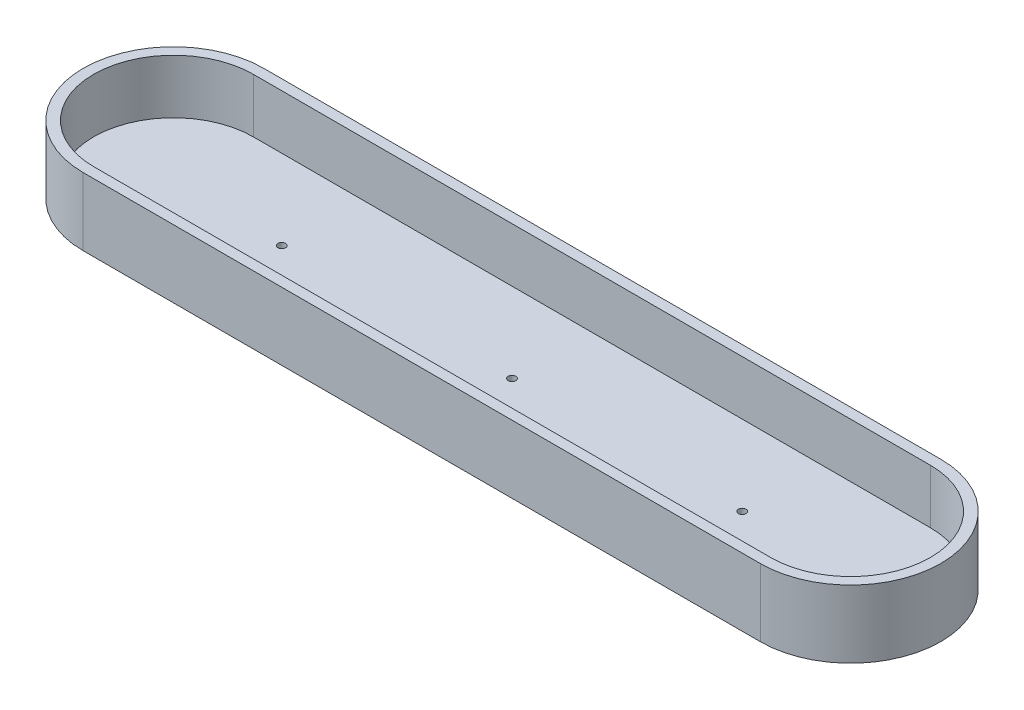
ISO-10303-21;
HEADER;
FILE_DESCRIPTION(('STEP AP214'),'2;1');
FILE_NAME('part.step','',(''),(''),'','','');
FILE_SCHEMA(('AUTOMOTIVE_DESIGN { 1 0 10303 214 1 1 1 1 }'));
ENDSEC;
DATA;
#1=APPLICATION_CONTEXT('core data for automotive mechanical design processes');
#2=APPLICATION_PROTOCOL_DEFINITION('international standard','automotive_design',2000,#1);
#3=PRODUCT_CONTEXT('',#1,'mechanical');
#4=PRODUCT('Part','Part','',(#3));
#5=PRODUCT_RELATED_PRODUCT_CATEGORY('part','',(#4));
#6=PRODUCT_DEFINITION_FORMATION('','',#4);
#7=PRODUCT_DEFINITION_CONTEXT('part definition',#1,'design');
#8=PRODUCT_DEFINITION('design','',#6,#7);
#9=PRODUCT_DEFINITION_SHAPE('','',#8);
#10=(LENGTH_UNIT() NAMED_UNIT(*) SI_UNIT(.MILLI.,.METRE.));
#11=(NAMED_UNIT(*) PLANE_ANGLE_UNIT() SI_UNIT($,.RADIAN.));
#12=(NAMED_UNIT(*) SI_UNIT($,.STERADIAN.) SOLID_ANGLE_UNIT());
#13=UNCERTAINTY_MEASURE_WITH_UNIT(LENGTH_MEASURE(1.E-05),#10,'distance_accuracy_value','');
#14=(GEOMETRIC_REPRESENTATION_CONTEXT(3) GLOBAL_UNCERTAINTY_ASSIGNED_CONTEXT((#13)) GLOBAL_UNIT_ASSIGNED_CONTEXT((#10,
#11,#12)) REPRESENTATION_CONTEXT('',''));
#15=CARTESIAN_POINT('',(0.,0.,0.));
#16=DIRECTION('',(0.,0.,1.));
#17=DIRECTION('',(1.,0.,0.));
#18=AXIS2_PLACEMENT_3D('',#15,#16,#17);
#19=CARTESIAN_POINT('',(-95.25,3.81,0.));
#20=DIRECTION('',(0.,1.,0.));
#21=DIRECTION('',(0.,0.,1.));
#22=AXIS2_PLACEMENT_3D('',#19,#20,#21);
#23=PLANE('',#22);
#24=CARTESIAN_POINT('',(64.77,3.81,0.));
#25=DIRECTION('',(0.,1.,0.));
#26=DIRECTION('',(0.,0.,1.));
#27=AXIS2_PLACEMENT_3D('',#24,#25,#26);
#28=CIRCLE('',#27,1.0795);
#29=CARTESIAN_POINT('',(64.77,3.81,-1.0795));
#30=VERTEX_POINT('',#29);
#31=EDGE_CURVE('E137',#30,#30,#28,.T.);
#32=ORIENTED_EDGE('',*,*,#31,.F.);
#33=EDGE_LOOP('',(#32));
#34=FACE_BOUND('',#33,.T.);
#35=CARTESIAN_POINT('',(-64.77,3.81,0.));
#36=DIRECTION('',(0.,1.,0.));
#37=DIRECTION('',(0.,0.,1.));
#38=AXIS2_PLACEMENT_3D('',#35,#36,#37);
#39=CIRCLE('',#38,1.0795);
#40=CARTESIAN_POINT('',(-64.77,3.81,-1.0795));
#41=VERTEX_POINT('',#40);
#42=EDGE_CURVE('E141',#41,#41,#39,.T.);
#43=ORIENTED_EDGE('',*,*,#42,.F.);
#44=EDGE_LOOP('',(#43));
#45=FACE_BOUND('',#44,.T.);
#46=CARTESIAN_POINT('',(0.,3.81,0.));
#47=DIRECTION('',(0.,1.,0.));
#48=DIRECTION('',(0.,0.,1.));
#49=AXIS2_PLACEMENT_3D('',#46,#47,#48);
#50=CIRCLE('',#49,1.0795);
#51=CARTESIAN_POINT('',(0.,3.81,-1.0795));
#52=VERTEX_POINT('',#51);
#53=EDGE_CURVE('E277',#52,#52,#50,.T.);
#54=ORIENTED_EDGE('',*,*,#53,.F.);
#55=EDGE_LOOP('',(#54));
#56=FACE_BOUND('',#55,.T.);
#57=CARTESIAN_POINT('',(-95.25,3.81,0.));
#58=DIRECTION('',(0.,1.,0.));
#59=DIRECTION('',(0.,0.,1.));
#60=AXIS2_PLACEMENT_3D('',#57,#58,#59);
#61=CIRCLE('',#60,22.479);
#62=CARTESIAN_POINT('',(-95.25,3.81,-22.479));
#63=VERTEX_POINT('',#62);
#64=CARTESIAN_POINT('',(-95.25,3.81,22.479));
#65=VERTEX_POINT('',#64);
#66=EDGE_CURVE('E118',#63,#65,#61,.T.);
#67=ORIENTED_EDGE('',*,*,#66,.T.);
#68=DIRECTION('',(1.,0.,0.));
#69=VECTOR('',#68,1.);
#70=CARTESIAN_POINT('',(-95.25,3.81,22.479));
#71=LINE('',#70,#69);
#72=CARTESIAN_POINT('',(95.25,3.81,22.479));
#73=VERTEX_POINT('',#72);
#74=EDGE_CURVE('E71',#65,#73,#71,.T.);
#75=ORIENTED_EDGE('',*,*,#74,.T.);
#76=CARTESIAN_POINT('',(95.25,3.81,0.));
#77=DIRECTION('',(0.,1.,0.));
#78=DIRECTION('',(0.,0.,-1.));
#79=AXIS2_PLACEMENT_3D('',#76,#77,#78);
#80=CIRCLE('',#79,22.479);
#81=CARTESIAN_POINT('',(95.25,3.81,-22.479));
#82=VERTEX_POINT('',#81);
#83=EDGE_CURVE('E56',#73,#82,#80,.T.);
#84=ORIENTED_EDGE('',*,*,#83,.T.);
#85=DIRECTION('',(-1.,0.,0.));
#86=VECTOR('',#85,1.);
#87=CARTESIAN_POINT('',(-95.25,3.81,-22.479));
#88=LINE('',#87,#86);
#89=EDGE_CURVE('E11',#82,#63,#88,.T.);
#90=ORIENTED_EDGE('',*,*,#89,.T.);
#91=EDGE_LOOP('',(#67,#75,#84,#90));
#92=FACE_BOUND('',#91,.T.);
#93=ADVANCED_FACE('F47',(#34,#45,#56,#92),#23,.T.);
#94=CARTESIAN_POINT('',(-95.25,19.05,0.));
#95=DIRECTION('',(0.,-1.,0.));
#96=DIRECTION('',(0.,0.,-1.));
#97=AXIS2_PLACEMENT_3D('',#94,#95,#96);
#98=CYLINDRICAL_SURFACE('',#97,25.4);
#99=CARTESIAN_POINT('',(-95.25,0.,0.));
#100=DIRECTION('',(0.,-1.,0.));
#101=DIRECTION('',(0.,0.,-1.));
#102=AXIS2_PLACEMENT_3D('',#99,#100,#101);
#103=CIRCLE('',#102,25.4);
#104=CARTESIAN_POINT('',(-95.25,0.,25.4));
#105=VERTEX_POINT('',#104);
#106=CARTESIAN_POINT('',(-95.25,0.,-25.4));
#107=VERTEX_POINT('',#106);
#108=EDGE_CURVE('E152',#105,#107,#103,.T.);
#109=ORIENTED_EDGE('',*,*,#108,.F.);
#110=DIRECTION('',(0.,-1.,0.));
#111=VECTOR('',#110,1.);
#112=CARTESIAN_POINT('',(-95.25,19.05,25.4));
#113=LINE('',#112,#111);
#114=CARTESIAN_POINT('',(-95.25,19.05,25.4));
#115=VERTEX_POINT('',#114);
#116=EDGE_CURVE('E190',#115,#105,#113,.T.);
#117=ORIENTED_EDGE('',*,*,#116,.F.);
#118=CARTESIAN_POINT('',(-95.25,19.05,0.));
#119=DIRECTION('',(0.,-1.,0.));
#120=DIRECTION('',(0.,0.,-1.));
#121=AXIS2_PLACEMENT_3D('',#118,#119,#120);
#122=CIRCLE('',#121,25.4);
#123=CARTESIAN_POINT('',(-95.25,19.05,-25.4));
#124=VERTEX_POINT('',#123);
#125=EDGE_CURVE('E158',#115,#124,#122,.T.);
#126=ORIENTED_EDGE('',*,*,#125,.T.);
#127=DIRECTION('',(0.,-1.,0.));
#128=VECTOR('',#127,1.);
#129=CARTESIAN_POINT('',(-95.25,19.05,-25.4));
#130=LINE('',#129,#128);
#131=EDGE_CURVE('E175',#124,#107,#130,.T.);
#132=ORIENTED_EDGE('',*,*,#131,.T.);
#133=EDGE_LOOP('',(#109,#117,#126,#132));
#134=FACE_BOUND('',#133,.T.);
#135=ADVANCED_FACE('F220',(#134),#98,.T.);
#136=CARTESIAN_POINT('',(-95.25,19.05,25.4));
#137=DIRECTION('',(0.,0.,1.));
#138=DIRECTION('',(1.,0.,0.));
#139=AXIS2_PLACEMENT_3D('',#136,#137,#138);
#140=PLANE('',#139);
#141=DIRECTION('',(-1.,0.,0.));
#142=VECTOR('',#141,1.);
#143=CARTESIAN_POINT('',(-95.25,0.,25.4));
#144=LINE('',#143,#142);
#145=CARTESIAN_POINT('',(95.25,0.,25.4));
#146=VERTEX_POINT('',#145);
#147=EDGE_CURVE('E163',#146,#105,#144,.T.);
#148=ORIENTED_EDGE('',*,*,#147,.F.);
#149=DIRECTION('',(0.,-1.,0.));
#150=VECTOR('',#149,1.);
#151=CARTESIAN_POINT('',(95.25,19.05,25.4));
#152=LINE('',#151,#150);
#153=CARTESIAN_POINT('',(95.25,19.05,25.4));
#154=VERTEX_POINT('',#153);
#155=EDGE_CURVE('E193',#154,#146,#152,.T.);
#156=ORIENTED_EDGE('',*,*,#155,.F.);
#157=DIRECTION('',(-1.,0.,0.));
#158=VECTOR('',#157,1.);
#159=CARTESIAN_POINT('',(-95.25,19.05,25.4));
#160=LINE('',#159,#158);
#161=EDGE_CURVE('E171',#154,#115,#160,.T.);
#162=ORIENTED_EDGE('',*,*,#161,.T.);
#163=ORIENTED_EDGE('',*,*,#116,.T.);
#164=EDGE_LOOP('',(#148,#156,#162,#163));
#165=FACE_BOUND('',#164,.T.);
#166=ADVANCED_FACE('F227',(#165),#140,.T.);
#167=CARTESIAN_POINT('',(95.25,19.05,0.));
#168=DIRECTION('',(0.,-1.,0.));
#169=DIRECTION('',(0.,0.,-1.));
#170=AXIS2_PLACEMENT_3D('',#167,#168,#169);
#171=CYLINDRICAL_SURFACE('',#170,25.4);
#172=CARTESIAN_POINT('',(95.25,0.,0.));
#173=DIRECTION('',(0.,-1.,0.));
#174=DIRECTION('',(0.,0.,1.));
#175=AXIS2_PLACEMENT_3D('',#172,#173,#174);
#176=CIRCLE('',#175,25.4);
#177=CARTESIAN_POINT('',(95.25,0.,-25.4));
#178=VERTEX_POINT('',#177);
#179=EDGE_CURVE('E183',#178,#146,#176,.T.);
#180=ORIENTED_EDGE('',*,*,#179,.F.);
#181=DIRECTION('',(0.,-1.,0.));
#182=VECTOR('',#181,1.);
#183=CARTESIAN_POINT('',(95.25,19.05,-25.4));
#184=LINE('',#183,#182);
#185=CARTESIAN_POINT('',(95.25,19.05,-25.4));
#186=VERTEX_POINT('',#185);
#187=EDGE_CURVE('E196',#186,#178,#184,.T.);
#188=ORIENTED_EDGE('',*,*,#187,.F.);
#189=CARTESIAN_POINT('',(95.25,19.05,0.));
#190=DIRECTION('',(0.,-1.,0.));
#191=DIRECTION('',(0.,0.,1.));
#192=AXIS2_PLACEMENT_3D('',#189,#190,#191);
#193=CIRCLE('',#192,25.4);
#194=EDGE_CURVE('E167',#186,#154,#193,.T.);
#195=ORIENTED_EDGE('',*,*,#194,.T.);
#196=ORIENTED_EDGE('',*,*,#155,.T.);
#197=EDGE_LOOP('',(#180,#188,#195,#196));
#198=FACE_BOUND('',#197,.T.);
#199=ADVANCED_FACE('F236',(#198),#171,.T.);
#200=CARTESIAN_POINT('',(-95.25,19.05,-25.4));
#201=DIRECTION('',(0.,0.,-1.));
#202=DIRECTION('',(-1.,0.,0.));
#203=AXIS2_PLACEMENT_3D('',#200,#201,#202);
#204=PLANE('',#203);
#205=DIRECTION('',(1.,0.,0.));
#206=VECTOR('',#205,1.);
#207=CARTESIAN_POINT('',(-95.25,0.,-25.4));
#208=LINE('',#207,#206);
#209=EDGE_CURVE('E179',#107,#178,#208,.T.);
#210=ORIENTED_EDGE('',*,*,#209,.F.);
#211=ORIENTED_EDGE('',*,*,#131,.F.);
#212=DIRECTION('',(1.,0.,0.));
#213=VECTOR('',#212,1.);
#214=CARTESIAN_POINT('',(-95.25,19.05,-25.4));
#215=LINE('',#214,#213);
#216=EDGE_CURVE('E162',#124,#186,#215,.T.);
#217=ORIENTED_EDGE('',*,*,#216,.T.);
#218=ORIENTED_EDGE('',*,*,#187,.T.);
#219=EDGE_LOOP('',(#210,#211,#217,#218));
#220=FACE_BOUND('',#219,.T.);
#221=ADVANCED_FACE('F233',(#220),#204,.T.);
#222=CARTESIAN_POINT('',(-95.25,19.05,0.));
#223=DIRECTION('',(0.,-1.,0.));
#224=DIRECTION('',(0.,0.,-1.));
#225=AXIS2_PLACEMENT_3D('',#222,#223,#224);
#226=PLANE('',#225);
#227=DIRECTION('',(-1.,0.,0.));
#228=VECTOR('',#227,1.);
#229=CARTESIAN_POINT('',(95.25,19.05,22.479));
#230=LINE('',#229,#228);
#231=CARTESIAN_POINT('',(95.25,19.05,22.479));
#232=VERTEX_POINT('',#231);
#233=CARTESIAN_POINT('',(-95.25,19.05,22.479));
#234=VERTEX_POINT('',#233);
#235=EDGE_CURVE('E121',#232,#234,#230,.T.);
#236=ORIENTED_EDGE('',*,*,#235,.T.);
#237=CARTESIAN_POINT('',(-95.25,19.05,0.));
#238=DIRECTION('',(0.,-1.,0.));
#239=DIRECTION('',(0.,0.,-1.));
#240=AXIS2_PLACEMENT_3D('',#237,#238,#239);
#241=CIRCLE('',#240,22.479);
#242=CARTESIAN_POINT('',(-95.25,19.05,-22.479));
#243=VERTEX_POINT('',#242);
#244=EDGE_CURVE('E115',#234,#243,#241,.T.);
#245=ORIENTED_EDGE('',*,*,#244,.T.);
#246=DIRECTION('',(1.,0.,0.));
#247=VECTOR('',#246,1.);
#248=CARTESIAN_POINT('',(95.25,19.05,-22.479));
#249=LINE('',#248,#247);
#250=CARTESIAN_POINT('',(95.25,19.05,-22.479));
#251=VERTEX_POINT('',#250);
#252=EDGE_CURVE('E125',#243,#251,#249,.T.);
#253=ORIENTED_EDGE('',*,*,#252,.T.);
#254=CARTESIAN_POINT('',(95.25,19.05,0.));
#255=DIRECTION('',(0.,-1.,0.));
#256=DIRECTION('',(0.,0.,1.));
#257=AXIS2_PLACEMENT_3D('',#254,#255,#256);
#258=CIRCLE('',#257,22.479);
#259=EDGE_CURVE('E131',#251,#232,#258,.T.);
#260=ORIENTED_EDGE('',*,*,#259,.T.);
#261=EDGE_LOOP('',(#236,#245,#253,#260));
#262=FACE_BOUND('',#261,.T.);
#263=ORIENTED_EDGE('',*,*,#125,.F.);
#264=ORIENTED_EDGE('',*,*,#161,.F.);
#265=ORIENTED_EDGE('',*,*,#194,.F.);
#266=ORIENTED_EDGE('',*,*,#216,.F.);
#267=EDGE_LOOP('',(#263,#264,#265,#266));
#268=FACE_BOUND('',#267,.T.);
#269=ADVANCED_FACE('F133',(#262,#268),#226,.F.);
#270=CARTESIAN_POINT('',(-95.25,19.05,0.));
#271=DIRECTION('',(0.,-1.,0.));
#272=DIRECTION('',(0.,0.,-1.));
#273=AXIS2_PLACEMENT_3D('',#270,#271,#272);
#274=CYLINDRICAL_SURFACE('',#273,22.479);
#275=ORIENTED_EDGE('',*,*,#66,.F.);
#276=DIRECTION('',(0.,-1.,0.));
#277=VECTOR('',#276,1.);
#278=CARTESIAN_POINT('',(-95.25,19.05,-22.479));
#279=LINE('',#278,#277);
#280=EDGE_CURVE('E63',#243,#63,#279,.T.);
#281=ORIENTED_EDGE('',*,*,#280,.F.);
#282=ORIENTED_EDGE('',*,*,#244,.F.);
#283=DIRECTION('',(0.,-1.,0.));
#284=VECTOR('',#283,1.);
#285=CARTESIAN_POINT('',(-95.25,19.05,22.479));
#286=LINE('',#285,#284);
#287=EDGE_CURVE('E149',#234,#65,#286,.T.);
#288=ORIENTED_EDGE('',*,*,#287,.T.);
#289=EDGE_LOOP('',(#275,#281,#282,#288));
#290=FACE_BOUND('',#289,.T.);
#291=ADVANCED_FACE('F113',(#290),#274,.F.);
#292=CARTESIAN_POINT('',(95.25,19.05,22.479));
#293=DIRECTION('',(0.,0.,1.));
#294=DIRECTION('',(1.,0.,0.));
#295=AXIS2_PLACEMENT_3D('',#292,#293,#294);
#296=PLANE('',#295);
#297=ORIENTED_EDGE('',*,*,#74,.F.);
#298=ORIENTED_EDGE('',*,*,#287,.F.);
#299=ORIENTED_EDGE('',*,*,#235,.F.);
#300=DIRECTION('',(0.,-1.,0.));
#301=VECTOR('',#300,1.);
#302=CARTESIAN_POINT('',(95.25,19.05,22.479));
#303=LINE('',#302,#301);
#304=EDGE_CURVE('E153',#232,#73,#303,.T.);
#305=ORIENTED_EDGE('',*,*,#304,.T.);
#306=EDGE_LOOP('',(#297,#298,#299,#305));
#307=FACE_BOUND('',#306,.T.);
#308=ADVANCED_FACE('F209',(#307),#296,.F.);
#309=CARTESIAN_POINT('',(95.25,19.05,0.));
#310=DIRECTION('',(0.,-1.,0.));
#311=DIRECTION('',(0.,0.,-1.));
#312=AXIS2_PLACEMENT_3D('',#309,#310,#311);
#313=CYLINDRICAL_SURFACE('',#312,22.479);
#314=ORIENTED_EDGE('',*,*,#83,.F.);
#315=ORIENTED_EDGE('',*,*,#304,.F.);
#316=ORIENTED_EDGE('',*,*,#259,.F.);
#317=DIRECTION('',(0.,-1.,0.));
#318=VECTOR('',#317,1.);
#319=CARTESIAN_POINT('',(95.25,19.05,-22.479));
#320=LINE('',#319,#318);
#321=EDGE_CURVE('E120',#251,#82,#320,.T.);
#322=ORIENTED_EDGE('',*,*,#321,.T.);
#323=EDGE_LOOP('',(#314,#315,#316,#322));
#324=FACE_BOUND('',#323,.T.);
#325=ADVANCED_FACE('F208',(#324),#313,.F.);
#326=CARTESIAN_POINT('',(95.25,19.05,-22.479));
#327=DIRECTION('',(0.,0.,-1.));
#328=DIRECTION('',(-1.,0.,0.));
#329=AXIS2_PLACEMENT_3D('',#326,#327,#328);
#330=PLANE('',#329);
#331=ORIENTED_EDGE('',*,*,#89,.F.);
#332=ORIENTED_EDGE('',*,*,#321,.F.);
#333=ORIENTED_EDGE('',*,*,#252,.F.);
#334=ORIENTED_EDGE('',*,*,#280,.T.);
#335=EDGE_LOOP('',(#331,#332,#333,#334));
#336=FACE_BOUND('',#335,.T.);
#337=ADVANCED_FACE('F126',(#336),#330,.F.);
#338=CARTESIAN_POINT('',(-95.25,0.,0.));
#339=DIRECTION('',(0.,1.,0.));
#340=DIRECTION('',(0.,0.,1.));
#341=AXIS2_PLACEMENT_3D('',#338,#339,#340);
#342=PLANE('',#341);
#343=CARTESIAN_POINT('',(64.77,0.,0.));
#344=DIRECTION('',(0.,-1.,0.));
#345=DIRECTION('',(0.,0.,-1.));
#346=AXIS2_PLACEMENT_3D('',#343,#344,#345);
#347=CIRCLE('',#346,1.0795);
#348=CARTESIAN_POINT('',(64.77,0.,-1.0795));
#349=VERTEX_POINT('',#348);
#350=EDGE_CURVE('E258',#349,#349,#347,.T.);
#351=ORIENTED_EDGE('',*,*,#350,.F.);
#352=EDGE_LOOP('',(#351));
#353=FACE_BOUND('',#352,.T.);
#354=CARTESIAN_POINT('',(-64.77,0.,0.));
#355=DIRECTION('',(0.,-1.,0.));
#356=DIRECTION('',(0.,0.,-1.));
#357=AXIS2_PLACEMENT_3D('',#354,#355,#356);
#358=CIRCLE('',#357,1.0795);
#359=CARTESIAN_POINT('',(-64.77,0.,-1.0795));
#360=VERTEX_POINT('',#359);
#361=EDGE_CURVE('E262',#360,#360,#358,.T.);
#362=ORIENTED_EDGE('',*,*,#361,.F.);
#363=EDGE_LOOP('',(#362));
#364=FACE_BOUND('',#363,.T.);
#365=CARTESIAN_POINT('',(0.,0.,0.));
#366=DIRECTION('',(0.,-1.,0.));
#367=DIRECTION('',(0.,0.,-1.));
#368=AXIS2_PLACEMENT_3D('',#365,#366,#367);
#369=CIRCLE('',#368,1.0795);
#370=CARTESIAN_POINT('',(0.,0.,-1.0795));
#371=VERTEX_POINT('',#370);
#372=EDGE_CURVE('E266',#371,#371,#369,.T.);
#373=ORIENTED_EDGE('',*,*,#372,.F.);
#374=EDGE_LOOP('',(#373));
#375=FACE_BOUND('',#374,.T.);
#376=ORIENTED_EDGE('',*,*,#108,.T.);
#377=ORIENTED_EDGE('',*,*,#209,.T.);
#378=ORIENTED_EDGE('',*,*,#179,.T.);
#379=ORIENTED_EDGE('',*,*,#147,.T.);
#380=EDGE_LOOP('',(#376,#377,#378,#379));
#381=FACE_BOUND('',#380,.T.);
#382=ADVANCED_FACE('F49',(#353,#364,#375,#381),#342,.F.);
#383=CARTESIAN_POINT('',(0.,19.05,0.));
#384=DIRECTION('',(0.,-1.,0.));
#385=DIRECTION('',(0.,0.,-1.));
#386=AXIS2_PLACEMENT_3D('',#383,#384,#385);
#387=CYLINDRICAL_SURFACE('',#386,1.0795);
#388=CARTESIAN_POINT('',(0.,3.81,-1.0795));
#389=CARTESIAN_POINT('',(0.,3.7703125,-1.0795));
#390=CARTESIAN_POINT('',(0.,3.730625,-1.0795));
#391=CARTESIAN_POINT('',(0.,3.65125,-1.0795));
#392=CARTESIAN_POINT('',(0.,3.6115625,-1.0795));
#393=CARTESIAN_POINT('',(0.,3.5321875,-1.0795));
#394=CARTESIAN_POINT('',(0.,3.4925,-1.0795));
#395=CARTESIAN_POINT('',(0.,3.413125,-1.0795));
#396=CARTESIAN_POINT('',(0.,3.3734375,-1.0795));
#397=CARTESIAN_POINT('',(0.,3.2940625,-1.0795));
#398=CARTESIAN_POINT('',(0.,3.254375,-1.0795));
#399=CARTESIAN_POINT('',(0.,3.175,-1.0795));
#400=CARTESIAN_POINT('',(0.,3.1353125,-1.0795));
#401=CARTESIAN_POINT('',(0.,3.0559375,-1.0795));
#402=CARTESIAN_POINT('',(0.,3.01625,-1.0795));
#403=CARTESIAN_POINT('',(0.,2.936875,-1.0795));
#404=CARTESIAN_POINT('',(0.,2.8971875,-1.0795));
#405=CARTESIAN_POINT('',(0.,2.8178125,-1.0795));
#406=CARTESIAN_POINT('',(0.,2.778125,-1.0795));
#407=CARTESIAN_POINT('',(0.,2.69875,-1.0795));
#408=CARTESIAN_POINT('',(0.,2.6590625,-1.0795));
#409=CARTESIAN_POINT('',(0.,2.5796875,-1.0795));
#410=CARTESIAN_POINT('',(0.,2.54,-1.0795));
#411=CARTESIAN_POINT('',(0.,2.460625,-1.0795));
#412=CARTESIAN_POINT('',(0.,2.4209375,-1.0795));
#413=CARTESIAN_POINT('',(0.,2.3415625,-1.0795));
#414=CARTESIAN_POINT('',(0.,2.301875,-1.0795));
#415=CARTESIAN_POINT('',(0.,2.2225,-1.0795));
#416=CARTESIAN_POINT('',(0.,2.1828125,-1.0795));
#417=CARTESIAN_POINT('',(0.,2.1034375,-1.0795));
#418=CARTESIAN_POINT('',(0.,2.06375,-1.0795));
#419=CARTESIAN_POINT('',(0.,1.984375,-1.0795));
#420=CARTESIAN_POINT('',(0.,1.9446875,-1.0795));
#421=CARTESIAN_POINT('',(0.,1.8653125,-1.0795));
#422=CARTESIAN_POINT('',(0.,1.825625,-1.0795));
#423=CARTESIAN_POINT('',(0.,1.74625,-1.0795));
#424=CARTESIAN_POINT('',(0.,1.7065625,-1.0795));
#425=CARTESIAN_POINT('',(0.,1.6271875,-1.0795));
#426=CARTESIAN_POINT('',(0.,1.5875,-1.0795));
#427=CARTESIAN_POINT('',(0.,1.508125,-1.0795));
#428=CARTESIAN_POINT('',(0.,1.4684375,-1.0795));
#429=CARTESIAN_POINT('',(0.,1.3890625,-1.0795));
#430=CARTESIAN_POINT('',(0.,1.349375,-1.0795));
#431=CARTESIAN_POINT('',(0.,1.27,-1.0795));
#432=CARTESIAN_POINT('',(0.,1.2303125,-1.0795));
#433=CARTESIAN_POINT('',(0.,1.1509375,-1.0795));
#434=CARTESIAN_POINT('',(0.,1.11125,-1.0795));
#435=CARTESIAN_POINT('',(0.,1.031875,-1.0795));
#436=CARTESIAN_POINT('',(0.,0.992187500000002,-1.0795));
#437=CARTESIAN_POINT('',(0.,0.912812500000001,-1.0795));
#438=CARTESIAN_POINT('',(0.,0.873125,-1.0795));
#439=CARTESIAN_POINT('',(0.,0.793749999999999,-1.0795));
#440=CARTESIAN_POINT('',(0.,0.7540625,-1.0795));
#441=CARTESIAN_POINT('',(0.,0.6746875,-1.0795));
#442=CARTESIAN_POINT('',(0.,0.635,-1.0795));
#443=CARTESIAN_POINT('',(0.,0.555625000000001,-1.0795));
#444=CARTESIAN_POINT('',(0.,0.515937500000001,-1.0795));
#445=CARTESIAN_POINT('',(0.,0.436562500000001,-1.0795));
#446=CARTESIAN_POINT('',(0.,0.396875000000001,-1.0795));
#447=CARTESIAN_POINT('',(0.,0.317500000000001,-1.0795));
#448=CARTESIAN_POINT('',(0.,0.2778125,-1.0795));
#449=CARTESIAN_POINT('',(0.,0.198437499999999,-1.0795));
#450=CARTESIAN_POINT('',(0.,0.158749999999999,-1.0795));
#451=CARTESIAN_POINT('',(0.,0.0793749999999996,-1.0795));
#452=CARTESIAN_POINT('',(0.,0.0396874999999998,-1.0795));
#453=CARTESIAN_POINT('',(0.,0.,-1.0795));
#454=B_SPLINE_CURVE_WITH_KNOTS('',3,(#388,#389,#390,#391,#392,#393,#394,#395,#396,#397,#398,
#399,#400,#401,#402,#403,#404,#405,#406,#407,#408,#409,#410,#411,#412,#413,#414,#415,#416,#417,
#418,#419,#420,#421,#422,#423,#424,#425,#426,#427,#428,#429,#430,#431,#432,#433,#434,#435,#436,
#437,#438,#439,#440,#441,#442,#443,#444,#445,#446,#447,#448,#449,#450,#451,#452,#453),
.UNSPECIFIED.,.F.,.F.,(4,2,2,2,2,2,2,2,2,2,2,2,2,2,2,2,2,2,2,2,2,2,2,2,2,2,2,2,2,2,2,2,4),(0.,
0.119062499999999,0.238125,0.3571875,0.476249999999999,0.595312499999999,0.714374999999998,
0.833437499999997,0.9525,1.0715625,1.190625,1.3096875,1.42875,1.5478125,1.666875,1.7859375,
1.905,2.0240625,2.143125,2.2621875,2.38125,2.5003125,2.619375,2.7384375,2.8575,2.9765625,
3.095625,3.2146875,3.33375,3.4528125,3.571875,3.6909375,3.81),.UNSPECIFIED.);
#455=EDGE_CURVE('BSEAM248',#52,#371,#454,.T.);
#456=ORIENTED_EDGE('',*,*,#53,.T.);
#457=ORIENTED_EDGE('',*,*,#372,.T.);
#458=ORIENTED_EDGE('',*,*,#455,.T.);
#459=ORIENTED_EDGE('',*,*,#455,.F.);
#460=EDGE_LOOP('',(#456,#458,#457,#459));
#461=FACE_BOUND('',#460,.T.);
#462=ADVANCED_FACE('F248',(#461),#387,.F.);
#463=CARTESIAN_POINT('',(-64.77,19.05,0.));
#464=DIRECTION('',(0.,-1.,0.));
#465=DIRECTION('',(0.,0.,-1.));
#466=AXIS2_PLACEMENT_3D('',#463,#464,#465);
#467=CYLINDRICAL_SURFACE('',#466,1.0795);
#468=CARTESIAN_POINT('',(-64.77,3.81,-1.0795));
#469=CARTESIAN_POINT('',(-64.77,3.7703125,-1.0795));
#470=CARTESIAN_POINT('',(-64.77,3.730625,-1.0795));
#471=CARTESIAN_POINT('',(-64.77,3.65125,-1.0795));
#472=CARTESIAN_POINT('',(-64.77,3.6115625,-1.0795));
#473=CARTESIAN_POINT('',(-64.77,3.5321875,-1.0795));
#474=CARTESIAN_POINT('',(-64.77,3.4925,-1.0795));
#475=CARTESIAN_POINT('',(-64.77,3.413125,-1.0795));
#476=CARTESIAN_POINT('',(-64.77,3.3734375,-1.0795));
#477=CARTESIAN_POINT('',(-64.77,3.2940625,-1.0795));
#478=CARTESIAN_POINT('',(-64.77,3.254375,-1.0795));
#479=CARTESIAN_POINT('',(-64.77,3.175,-1.0795));
#480=CARTESIAN_POINT('',(-64.77,3.1353125,-1.0795));
#481=CARTESIAN_POINT('',(-64.77,3.0559375,-1.0795));
#482=CARTESIAN_POINT('',(-64.77,3.01625,-1.0795));
#483=CARTESIAN_POINT('',(-64.77,2.936875,-1.0795));
#484=CARTESIAN_POINT('',(-64.77,2.8971875,-1.0795));
#485=CARTESIAN_POINT('',(-64.77,2.8178125,-1.0795));
#486=CARTESIAN_POINT('',(-64.77,2.778125,-1.0795));
#487=CARTESIAN_POINT('',(-64.77,2.69875,-1.0795));
#488=CARTESIAN_POINT('',(-64.77,2.6590625,-1.0795));
#489=CARTESIAN_POINT('',(-64.77,2.5796875,-1.0795));
#490=CARTESIAN_POINT('',(-64.77,2.54,-1.0795));
#491=CARTESIAN_POINT('',(-64.77,2.460625,-1.0795));
#492=CARTESIAN_POINT('',(-64.77,2.4209375,-1.0795));
#493=CARTESIAN_POINT('',(-64.77,2.3415625,-1.0795));
#494=CARTESIAN_POINT('',(-64.77,2.301875,-1.0795));
#495=CARTESIAN_POINT('',(-64.77,2.2225,-1.0795));
#496=CARTESIAN_POINT('',(-64.77,2.1828125,-1.0795));
#497=CARTESIAN_POINT('',(-64.77,2.1034375,-1.0795));
#498=CARTESIAN_POINT('',(-64.77,2.06375,-1.0795));
#499=CARTESIAN_POINT('',(-64.77,1.984375,-1.0795));
#500=CARTESIAN_POINT('',(-64.77,1.9446875,-1.0795));
#501=CARTESIAN_POINT('',(-64.77,1.8653125,-1.0795));
#502=CARTESIAN_POINT('',(-64.77,1.825625,-1.0795));
#503=CARTESIAN_POINT('',(-64.77,1.74625,-1.0795));
#504=CARTESIAN_POINT('',(-64.77,1.7065625,-1.0795));
#505=CARTESIAN_POINT('',(-64.77,1.6271875,-1.0795));
#506=CARTESIAN_POINT('',(-64.77,1.5875,-1.0795));
#507=CARTESIAN_POINT('',(-64.77,1.508125,-1.0795));
#508=CARTESIAN_POINT('',(-64.77,1.4684375,-1.0795));
#509=CARTESIAN_POINT('',(-64.77,1.3890625,-1.0795));
#510=CARTESIAN_POINT('',(-64.77,1.349375,-1.0795));
#511=CARTESIAN_POINT('',(-64.77,1.27,-1.0795));
#512=CARTESIAN_POINT('',(-64.77,1.2303125,-1.0795));
#513=CARTESIAN_POINT('',(-64.77,1.1509375,-1.0795));
#514=CARTESIAN_POINT('',(-64.77,1.11125,-1.0795));
#515=CARTESIAN_POINT('',(-64.77,1.031875,-1.0795));
#516=CARTESIAN_POINT('',(-64.77,0.992187500000002,-1.0795));
#517=CARTESIAN_POINT('',(-64.77,0.912812500000001,-1.0795));
#518=CARTESIAN_POINT('',(-64.77,0.873125,-1.0795));
#519=CARTESIAN_POINT('',(-64.77,0.793749999999999,-1.0795));
#520=CARTESIAN_POINT('',(-64.77,0.7540625,-1.0795));
#521=CARTESIAN_POINT('',(-64.77,0.6746875,-1.0795));
#522=CARTESIAN_POINT('',(-64.77,0.635,-1.0795));
#523=CARTESIAN_POINT('',(-64.77,0.555625000000001,-1.0795));
#524=CARTESIAN_POINT('',(-64.77,0.515937500000001,-1.0795));
#525=CARTESIAN_POINT('',(-64.77,0.436562500000001,-1.0795));
#526=CARTESIAN_POINT('',(-64.77,0.396875000000001,-1.0795));
#527=CARTESIAN_POINT('',(-64.77,0.317500000000001,-1.0795));
#528=CARTESIAN_POINT('',(-64.77,0.2778125,-1.0795));
#529=CARTESIAN_POINT('',(-64.77,0.198437499999999,-1.0795));
#530=CARTESIAN_POINT('',(-64.77,0.158749999999999,-1.0795));
#531=CARTESIAN_POINT('',(-64.77,0.0793749999999996,-1.0795));
#532=CARTESIAN_POINT('',(-64.77,0.0396874999999998,-1.0795));
#533=CARTESIAN_POINT('',(-64.77,0.,-1.0795));
#534=B_SPLINE_CURVE_WITH_KNOTS('',3,(#468,#469,#470,#471,#472,#473,#474,#475,#476,#477,#478,
#479,#480,#481,#482,#483,#484,#485,#486,#487,#488,#489,#490,#491,#492,#493,#494,#495,#496,#497,
#498,#499,#500,#501,#502,#503,#504,#505,#506,#507,#508,#509,#510,#511,#512,#513,#514,#515,#516,
#517,#518,#519,#520,#521,#522,#523,#524,#525,#526,#527,#528,#529,#530,#531,#532,#533),
.UNSPECIFIED.,.F.,.F.,(4,2,2,2,2,2,2,2,2,2,2,2,2,2,2,2,2,2,2,2,2,2,2,2,2,2,2,2,2,2,2,2,4),(0.,
0.119062499999999,0.238125,0.3571875,0.476249999999999,0.595312499999999,0.714374999999998,
0.833437499999997,0.9525,1.0715625,1.190625,1.3096875,1.42875,1.5478125,1.666875,1.7859375,
1.905,2.0240625,2.143125,2.2621875,2.38125,2.5003125,2.619375,2.7384375,2.8575,2.9765625,
3.095625,3.2146875,3.33375,3.4528125,3.571875,3.6909375,3.81),.UNSPECIFIED.);
#535=EDGE_CURVE('BSEAM253',#41,#360,#534,.T.);
#536=ORIENTED_EDGE('',*,*,#42,.T.);
#537=ORIENTED_EDGE('',*,*,#361,.T.);
#538=ORIENTED_EDGE('',*,*,#535,.T.);
#539=ORIENTED_EDGE('',*,*,#535,.F.);
#540=EDGE_LOOP('',(#536,#538,#537,#539));
#541=FACE_BOUND('',#540,.T.);
#542=ADVANCED_FACE('F253',(#541),#467,.F.);
#543=CARTESIAN_POINT('',(64.77,19.05,0.));
#544=DIRECTION('',(0.,-1.,0.));
#545=DIRECTION('',(0.,0.,-1.));
#546=AXIS2_PLACEMENT_3D('',#543,#544,#545);
#547=CYLINDRICAL_SURFACE('',#546,1.0795);
#548=CARTESIAN_POINT('',(64.77,3.81,-1.0795));
#549=CARTESIAN_POINT('',(64.77,3.7703125,-1.0795));
#550=CARTESIAN_POINT('',(64.77,3.730625,-1.0795));
#551=CARTESIAN_POINT('',(64.77,3.65125,-1.0795));
#552=CARTESIAN_POINT('',(64.77,3.6115625,-1.0795));
#553=CARTESIAN_POINT('',(64.77,3.5321875,-1.0795));
#554=CARTESIAN_POINT('',(64.77,3.4925,-1.0795));
#555=CARTESIAN_POINT('',(64.77,3.413125,-1.0795));
#556=CARTESIAN_POINT('',(64.77,3.3734375,-1.0795));
#557=CARTESIAN_POINT('',(64.77,3.2940625,-1.0795));
#558=CARTESIAN_POINT('',(64.77,3.254375,-1.0795));
#559=CARTESIAN_POINT('',(64.77,3.175,-1.0795));
#560=CARTESIAN_POINT('',(64.77,3.1353125,-1.0795));
#561=CARTESIAN_POINT('',(64.77,3.0559375,-1.0795));
#562=CARTESIAN_POINT('',(64.77,3.01625,-1.0795));
#563=CARTESIAN_POINT('',(64.77,2.936875,-1.0795));
#564=CARTESIAN_POINT('',(64.77,2.8971875,-1.0795));
#565=CARTESIAN_POINT('',(64.77,2.8178125,-1.0795));
#566=CARTESIAN_POINT('',(64.77,2.778125,-1.0795));
#567=CARTESIAN_POINT('',(64.77,2.69875,-1.0795));
#568=CARTESIAN_POINT('',(64.77,2.6590625,-1.0795));
#569=CARTESIAN_POINT('',(64.77,2.5796875,-1.0795));
#570=CARTESIAN_POINT('',(64.77,2.54,-1.0795));
#571=CARTESIAN_POINT('',(64.77,2.460625,-1.0795));
#572=CARTESIAN_POINT('',(64.77,2.4209375,-1.0795));
#573=CARTESIAN_POINT('',(64.77,2.3415625,-1.0795));
#574=CARTESIAN_POINT('',(64.77,2.301875,-1.0795));
#575=CARTESIAN_POINT('',(64.77,2.2225,-1.0795));
#576=CARTESIAN_POINT('',(64.77,2.1828125,-1.0795));
#577=CARTESIAN_POINT('',(64.77,2.1034375,-1.0795));
#578=CARTESIAN_POINT('',(64.77,2.06375,-1.0795));
#579=CARTESIAN_POINT('',(64.77,1.984375,-1.0795));
#580=CARTESIAN_POINT('',(64.77,1.9446875,-1.0795));
#581=CARTESIAN_POINT('',(64.77,1.8653125,-1.0795));
#582=CARTESIAN_POINT('',(64.77,1.825625,-1.0795));
#583=CARTESIAN_POINT('',(64.77,1.74625,-1.0795));
#584=CARTESIAN_POINT('',(64.77,1.7065625,-1.0795));
#585=CARTESIAN_POINT('',(64.77,1.6271875,-1.0795));
#586=CARTESIAN_POINT('',(64.77,1.5875,-1.0795));
#587=CARTESIAN_POINT('',(64.77,1.508125,-1.0795));
#588=CARTESIAN_POINT('',(64.77,1.4684375,-1.0795));
#589=CARTESIAN_POINT('',(64.77,1.3890625,-1.0795));
#590=CARTESIAN_POINT('',(64.77,1.349375,-1.0795));
#591=CARTESIAN_POINT('',(64.77,1.27,-1.0795));
#592=CARTESIAN_POINT('',(64.77,1.2303125,-1.0795));
#593=CARTESIAN_POINT('',(64.77,1.1509375,-1.0795));
#594=CARTESIAN_POINT('',(64.77,1.11125,-1.0795));
#595=CARTESIAN_POINT('',(64.77,1.031875,-1.0795));
#596=CARTESIAN_POINT('',(64.77,0.992187500000002,-1.0795));
#597=CARTESIAN_POINT('',(64.77,0.912812500000001,-1.0795));
#598=CARTESIAN_POINT('',(64.77,0.873125,-1.0795));
#599=CARTESIAN_POINT('',(64.77,0.793749999999999,-1.0795));
#600=CARTESIAN_POINT('',(64.77,0.7540625,-1.0795));
#601=CARTESIAN_POINT('',(64.77,0.6746875,-1.0795));
#602=CARTESIAN_POINT('',(64.77,0.635,-1.0795));
#603=CARTESIAN_POINT('',(64.77,0.555625000000001,-1.0795));
#604=CARTESIAN_POINT('',(64.77,0.515937500000001,-1.0795));
#605=CARTESIAN_POINT('',(64.77,0.436562500000001,-1.0795));
#606=CARTESIAN_POINT('',(64.77,0.396875000000001,-1.0795));
#607=CARTESIAN_POINT('',(64.77,0.317500000000001,-1.0795));
#608=CARTESIAN_POINT('',(64.77,0.2778125,-1.0795));
#609=CARTESIAN_POINT('',(64.77,0.198437499999999,-1.0795));
#610=CARTESIAN_POINT('',(64.77,0.158749999999999,-1.0795));
#611=CARTESIAN_POINT('',(64.77,0.0793749999999996,-1.0795));
#612=CARTESIAN_POINT('',(64.77,0.0396874999999998,-1.0795));
#613=CARTESIAN_POINT('',(64.77,0.,-1.0795));
#614=B_SPLINE_CURVE_WITH_KNOTS('',3,(#548,#549,#550,#551,#552,#553,#554,#555,#556,#557,#558,
#559,#560,#561,#562,#563,#564,#565,#566,#567,#568,#569,#570,#571,#572,#573,#574,#575,#576,#577,
#578,#579,#580,#581,#582,#583,#584,#585,#586,#587,#588,#589,#590,#591,#592,#593,#594,#595,#596,
#597,#598,#599,#600,#601,#602,#603,#604,#605,#606,#607,#608,#609,#610,#611,#612,#613),
.UNSPECIFIED.,.F.,.F.,(4,2,2,2,2,2,2,2,2,2,2,2,2,2,2,2,2,2,2,2,2,2,2,2,2,2,2,2,2,2,2,2,4),(0.,
0.119062499999999,0.238125,0.3571875,0.476249999999999,0.595312499999999,0.714374999999998,
0.833437499999997,0.9525,1.0715625,1.190625,1.3096875,1.42875,1.5478125,1.666875,1.7859375,
1.905,2.0240625,2.143125,2.2621875,2.38125,2.5003125,2.619375,2.7384375,2.8575,2.9765625,
3.095625,3.2146875,3.33375,3.4528125,3.571875,3.6909375,3.81),.UNSPECIFIED.);
#615=EDGE_CURVE('BSEAM293',#30,#349,#614,.T.);
#616=ORIENTED_EDGE('',*,*,#31,.T.);
#617=ORIENTED_EDGE('',*,*,#350,.T.);
#618=ORIENTED_EDGE('',*,*,#615,.T.);
#619=ORIENTED_EDGE('',*,*,#615,.F.);
#620=EDGE_LOOP('',(#616,#618,#617,#619));
#621=FACE_BOUND('',#620,.T.);
#622=ADVANCED_FACE('F293',(#621),#547,.F.);
#623=CLOSED_SHELL('',(#93,#135,#166,#199,#221,#269,#291,#308,#325,#337,#382,#462,#542,#622));
#624=MANIFOLD_SOLID_BREP('B2',#623);
#625=ADVANCED_BREP_SHAPE_REPRESENTATION('',(#18,#624),#14);
#626=SHAPE_DEFINITION_REPRESENTATION(#9,#625);
ENDSEC;
END-ISO-10303-21;
